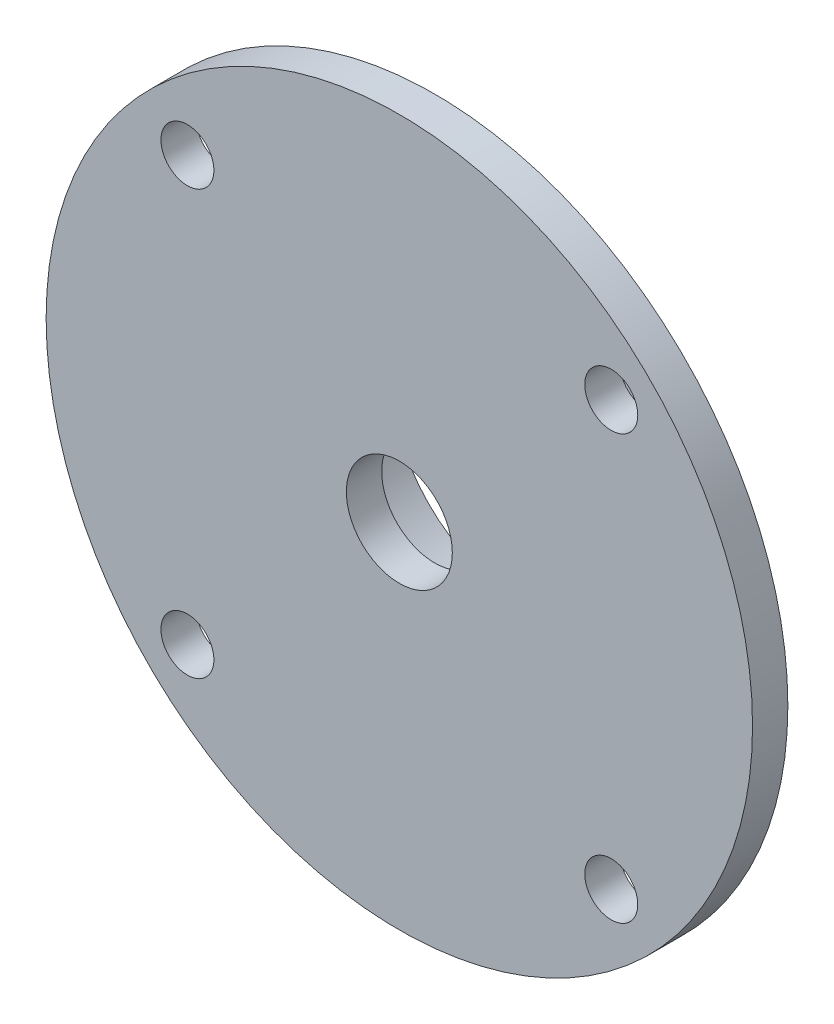
ISO-10303-21;
HEADER;
FILE_DESCRIPTION(('STEP AP214'),'2;1');
FILE_NAME('part.step','',(''),(''),'','','');
FILE_SCHEMA(('AUTOMOTIVE_DESIGN { 1 0 10303 214 1 1 1 1 }'));
ENDSEC;
DATA;
#1=APPLICATION_CONTEXT('core data for automotive mechanical design processes');
#2=APPLICATION_PROTOCOL_DEFINITION('international standard','automotive_design',2000,#1);
#3=PRODUCT_CONTEXT('',#1,'mechanical');
#4=PRODUCT('Part','Part','',(#3));
#5=PRODUCT_RELATED_PRODUCT_CATEGORY('part','',(#4));
#6=PRODUCT_DEFINITION_FORMATION('','',#4);
#7=PRODUCT_DEFINITION_CONTEXT('part definition',#1,'design');
#8=PRODUCT_DEFINITION('design','',#6,#7);
#9=PRODUCT_DEFINITION_SHAPE('','',#8);
#10=(LENGTH_UNIT() NAMED_UNIT(*) SI_UNIT(.MILLI.,.METRE.));
#11=(NAMED_UNIT(*) PLANE_ANGLE_UNIT() SI_UNIT($,.RADIAN.));
#12=(NAMED_UNIT(*) SI_UNIT($,.STERADIAN.) SOLID_ANGLE_UNIT());
#13=UNCERTAINTY_MEASURE_WITH_UNIT(LENGTH_MEASURE(1.E-05),#10,'distance_accuracy_value','');
#14=(GEOMETRIC_REPRESENTATION_CONTEXT(3) GLOBAL_UNCERTAINTY_ASSIGNED_CONTEXT((#13)) GLOBAL_UNIT_ASSIGNED_CONTEXT((#10,
#11,#12)) REPRESENTATION_CONTEXT('',''));
#15=CARTESIAN_POINT('',(0.,0.,0.));
#16=DIRECTION('',(0.,0.,1.));
#17=DIRECTION('',(1.,0.,0.));
#18=AXIS2_PLACEMENT_3D('',#15,#16,#17);
#19=CARTESIAN_POINT('',(0.,0.,0.));
#20=DIRECTION('',(0.,0.,1.));
#21=DIRECTION('',(1.,0.,0.));
#22=AXIS2_PLACEMENT_3D('',#19,#20,#21);
#23=PLANE('',#22);
#24=CARTESIAN_POINT('',(0.,0.,0.));
#25=DIRECTION('',(0.,0.,1.));
#26=DIRECTION('',(1.,0.,0.));
#27=AXIS2_PLACEMENT_3D('',#24,#25,#26);
#28=CIRCLE('',#27,3.);
#29=CARTESIAN_POINT('',(3.,0.,0.));
#30=VERTEX_POINT('',#29);
#31=EDGE_CURVE('E55',#30,#30,#28,.T.);
#32=ORIENTED_EDGE('',*,*,#31,.T.);
#33=EDGE_LOOP('',(#32));
#34=FACE_BOUND('',#33,.T.);
#35=CARTESIAN_POINT('',(0.,0.,0.));
#36=DIRECTION('',(0.,0.,-1.));
#37=DIRECTION('',(-1.,0.,0.));
#38=AXIS2_PLACEMENT_3D('',#35,#36,#37);
#39=CIRCLE('',#38,7.5);
#40=CARTESIAN_POINT('',(-7.5,0.,0.));
#41=VERTEX_POINT('',#40);
#42=EDGE_CURVE('E82',#41,#41,#39,.T.);
#43=ORIENTED_EDGE('',*,*,#42,.T.);
#44=EDGE_LOOP('',(#43));
#45=FACE_BOUND('',#44,.T.);
#46=ADVANCED_FACE('F31',(#34,#45),#23,.F.);
#47=CARTESIAN_POINT('',(0.,0.,2.));
#48=DIRECTION('',(0.,0.,1.));
#49=DIRECTION('',(1.,0.,0.));
#50=AXIS2_PLACEMENT_3D('',#47,#48,#49);
#51=PLANE('',#50);
#52=CARTESIAN_POINT('',(12.0000000000004,-11.9999999999996,2.));
#53=DIRECTION('',(0.,0.,1.));
#54=DIRECTION('',(1.,0.,0.));
#55=AXIS2_PLACEMENT_3D('',#52,#53,#54);
#56=CIRCLE('',#55,1.50000000000055);
#57=CARTESIAN_POINT('',(13.5000000000009,-11.9999999999996,2.));
#58=VERTEX_POINT('',#57);
#59=EDGE_CURVE('E64',#58,#58,#56,.T.);
#60=ORIENTED_EDGE('',*,*,#59,.F.);
#61=EDGE_LOOP('',(#60));
#62=FACE_BOUND('',#61,.T.);
#63=CARTESIAN_POINT('',(0.,0.,2.));
#64=DIRECTION('',(0.,0.,1.));
#65=DIRECTION('',(1.,0.,0.));
#66=AXIS2_PLACEMENT_3D('',#63,#64,#65);
#67=CIRCLE('',#66,3.);
#68=CARTESIAN_POINT('',(3.,0.,2.));
#69=VERTEX_POINT('',#68);
#70=EDGE_CURVE('E52',#69,#69,#67,.T.);
#71=ORIENTED_EDGE('',*,*,#70,.F.);
#72=EDGE_LOOP('',(#71));
#73=FACE_BOUND('',#72,.T.);
#74=CARTESIAN_POINT('',(0.,0.,2.));
#75=DIRECTION('',(0.,0.,1.));
#76=DIRECTION('',(1.,0.,0.));
#77=AXIS2_PLACEMENT_3D('',#74,#75,#76);
#78=CIRCLE('',#77,20.);
#79=CARTESIAN_POINT('',(20.,0.,2.));
#80=VERTEX_POINT('',#79);
#81=EDGE_CURVE('E38',#80,#80,#78,.T.);
#82=ORIENTED_EDGE('',*,*,#81,.T.);
#83=EDGE_LOOP('',(#82));
#84=FACE_BOUND('',#83,.T.);
#85=CARTESIAN_POINT('',(-12.,12.,2.));
#86=DIRECTION('',(0.,0.,1.));
#87=DIRECTION('',(1.,0.,0.));
#88=AXIS2_PLACEMENT_3D('',#85,#86,#87);
#89=CIRCLE('',#88,1.50000000000055);
#90=CARTESIAN_POINT('',(-10.4999999999995,12.,2.));
#91=VERTEX_POINT('',#90);
#92=EDGE_CURVE('E47',#91,#91,#89,.T.);
#93=ORIENTED_EDGE('',*,*,#92,.F.);
#94=EDGE_LOOP('',(#93));
#95=FACE_BOUND('',#94,.T.);
#96=CARTESIAN_POINT('',(12.,12.0000000000004,2.));
#97=DIRECTION('',(0.,0.,1.));
#98=DIRECTION('',(1.,0.,0.));
#99=AXIS2_PLACEMENT_3D('',#96,#97,#98);
#100=CIRCLE('',#99,1.50000000000055);
#101=CARTESIAN_POINT('',(13.5000000000005,12.0000000000004,2.));
#102=VERTEX_POINT('',#101);
#103=EDGE_CURVE('E58',#102,#102,#100,.T.);
#104=ORIENTED_EDGE('',*,*,#103,.F.);
#105=EDGE_LOOP('',(#104));
#106=FACE_BOUND('',#105,.T.);
#107=CARTESIAN_POINT('',(-11.9999999999996,-12.,2.));
#108=DIRECTION('',(0.,0.,1.));
#109=DIRECTION('',(1.,0.,0.));
#110=AXIS2_PLACEMENT_3D('',#107,#108,#109);
#111=CIRCLE('',#110,1.50000000000055);
#112=CARTESIAN_POINT('',(-10.4999999999991,-12.,2.));
#113=VERTEX_POINT('',#112);
#114=EDGE_CURVE('E70',#113,#113,#111,.T.);
#115=ORIENTED_EDGE('',*,*,#114,.F.);
#116=EDGE_LOOP('',(#115));
#117=FACE_BOUND('',#116,.T.);
#118=ADVANCED_FACE('F108',(#62,#73,#84,#95,#106,#117),#51,.T.);
#119=CARTESIAN_POINT('',(0.,0.,0.));
#120=DIRECTION('',(0.,0.,1.));
#121=DIRECTION('',(1.,0.,0.));
#122=AXIS2_PLACEMENT_3D('',#119,#120,#121);
#123=CIRCLE('',#122,11.);
#124=CARTESIAN_POINT('',(11.,0.,0.));
#125=VERTEX_POINT('',#124);
#126=EDGE_CURVE('E10',#125,#125,#123,.F.);
#127=ORIENTED_EDGE('',*,*,#126,.F.);
#128=EDGE_LOOP('',(#127));
#129=FACE_BOUND('',#128,.T.);
#130=CARTESIAN_POINT('',(0.,0.,0.));
#131=DIRECTION('',(0.,0.,1.));
#132=DIRECTION('',(1.,0.,0.));
#133=AXIS2_PLACEMENT_3D('',#130,#131,#132);
#134=CIRCLE('',#133,20.);
#135=CARTESIAN_POINT('',(20.,0.,0.));
#136=VERTEX_POINT('',#135);
#137=EDGE_CURVE('E42',#136,#136,#134,.T.);
#138=ORIENTED_EDGE('',*,*,#137,.F.);
#139=EDGE_LOOP('',(#138));
#140=FACE_BOUND('',#139,.T.);
#141=CARTESIAN_POINT('',(-12.,12.,0.));
#142=DIRECTION('',(0.,0.,1.));
#143=DIRECTION('',(1.,0.,0.));
#144=AXIS2_PLACEMENT_3D('',#141,#142,#143);
#145=CIRCLE('',#144,1.50000000000055);
#146=CARTESIAN_POINT('',(-10.4999999999995,12.,0.));
#147=VERTEX_POINT('',#146);
#148=EDGE_CURVE('E49',#147,#147,#145,.T.);
#149=ORIENTED_EDGE('',*,*,#148,.T.);
#150=EDGE_LOOP('',(#149));
#151=FACE_BOUND('',#150,.T.);
#152=CARTESIAN_POINT('',(12.,12.0000000000004,0.));
#153=DIRECTION('',(0.,0.,1.));
#154=DIRECTION('',(1.,0.,0.));
#155=AXIS2_PLACEMENT_3D('',#152,#153,#154);
#156=CIRCLE('',#155,1.50000000000055);
#157=CARTESIAN_POINT('',(13.5000000000005,12.0000000000004,0.));
#158=VERTEX_POINT('',#157);
#159=EDGE_CURVE('E61',#158,#158,#156,.T.);
#160=ORIENTED_EDGE('',*,*,#159,.T.);
#161=EDGE_LOOP('',(#160));
#162=FACE_BOUND('',#161,.T.);
#163=CARTESIAN_POINT('',(12.0000000000004,-11.9999999999996,0.));
#164=DIRECTION('',(0.,0.,1.));
#165=DIRECTION('',(1.,0.,0.));
#166=AXIS2_PLACEMENT_3D('',#163,#164,#165);
#167=CIRCLE('',#166,1.50000000000055);
#168=CARTESIAN_POINT('',(13.5000000000009,-11.9999999999996,0.));
#169=VERTEX_POINT('',#168);
#170=EDGE_CURVE('E67',#169,#169,#167,.T.);
#171=ORIENTED_EDGE('',*,*,#170,.T.);
#172=EDGE_LOOP('',(#171));
#173=FACE_BOUND('',#172,.T.);
#174=CARTESIAN_POINT('',(-11.9999999999996,-12.,0.));
#175=DIRECTION('',(0.,0.,1.));
#176=DIRECTION('',(1.,0.,0.));
#177=AXIS2_PLACEMENT_3D('',#174,#175,#176);
#178=CIRCLE('',#177,1.50000000000055);
#179=CARTESIAN_POINT('',(-10.4999999999991,-12.,0.));
#180=VERTEX_POINT('',#179);
#181=EDGE_CURVE('E73',#180,#180,#178,.T.);
#182=ORIENTED_EDGE('',*,*,#181,.T.);
#183=EDGE_LOOP('',(#182));
#184=FACE_BOUND('',#183,.T.);
#185=ADVANCED_FACE('F110',(#129,#140,#151,#162,#173,#184),#23,.F.);
#186=CARTESIAN_POINT('',(0.,0.,2.));
#187=DIRECTION('',(0.,0.,-1.));
#188=DIRECTION('',(-1.,0.,0.));
#189=AXIS2_PLACEMENT_3D('',#186,#187,#188);
#190=CYLINDRICAL_SURFACE('',#189,20.);
#191=ORIENTED_EDGE('',*,*,#81,.F.);
#192=EDGE_LOOP('',(#191));
#193=FACE_BOUND('',#192,.T.);
#194=ORIENTED_EDGE('',*,*,#137,.T.);
#195=EDGE_LOOP('',(#194));
#196=FACE_BOUND('',#195,.T.);
#197=ADVANCED_FACE('F33',(#193,#196),#190,.T.);
#198=CARTESIAN_POINT('',(-12.,12.,2.));
#199=DIRECTION('',(0.,0.,-1.));
#200=DIRECTION('',(-1.,0.,0.));
#201=AXIS2_PLACEMENT_3D('',#198,#199,#200);
#202=CYLINDRICAL_SURFACE('',#201,1.50000000000055);
#203=ORIENTED_EDGE('',*,*,#92,.T.);
#204=EDGE_LOOP('',(#203));
#205=FACE_BOUND('',#204,.T.);
#206=ORIENTED_EDGE('',*,*,#148,.F.);
#207=EDGE_LOOP('',(#206));
#208=FACE_BOUND('',#207,.T.);
#209=ADVANCED_FACE('F122',(#205,#208),#202,.F.);
#210=CARTESIAN_POINT('',(0.,0.,2.));
#211=DIRECTION('',(0.,0.,-1.));
#212=DIRECTION('',(-1.,0.,0.));
#213=AXIS2_PLACEMENT_3D('',#210,#211,#212);
#214=CYLINDRICAL_SURFACE('',#213,3.);
#215=ORIENTED_EDGE('',*,*,#70,.T.);
#216=EDGE_LOOP('',(#215));
#217=FACE_BOUND('',#216,.T.);
#218=ORIENTED_EDGE('',*,*,#31,.F.);
#219=EDGE_LOOP('',(#218));
#220=FACE_BOUND('',#219,.T.);
#221=ADVANCED_FACE('F143',(#217,#220),#214,.F.);
#222=CARTESIAN_POINT('',(12.,12.0000000000004,2.));
#223=DIRECTION('',(0.,0.,-1.));
#224=DIRECTION('',(-1.,0.,0.));
#225=AXIS2_PLACEMENT_3D('',#222,#223,#224);
#226=CYLINDRICAL_SURFACE('',#225,1.50000000000055);
#227=ORIENTED_EDGE('',*,*,#103,.T.);
#228=EDGE_LOOP('',(#227));
#229=FACE_BOUND('',#228,.T.);
#230=ORIENTED_EDGE('',*,*,#159,.F.);
#231=EDGE_LOOP('',(#230));
#232=FACE_BOUND('',#231,.T.);
#233=ADVANCED_FACE('F137',(#229,#232),#226,.F.);
#234=CARTESIAN_POINT('',(12.0000000000004,-11.9999999999996,2.));
#235=DIRECTION('',(0.,0.,-1.));
#236=DIRECTION('',(-1.,0.,0.));
#237=AXIS2_PLACEMENT_3D('',#234,#235,#236);
#238=CYLINDRICAL_SURFACE('',#237,1.50000000000055);
#239=ORIENTED_EDGE('',*,*,#59,.T.);
#240=EDGE_LOOP('',(#239));
#241=FACE_BOUND('',#240,.T.);
#242=ORIENTED_EDGE('',*,*,#170,.F.);
#243=EDGE_LOOP('',(#242));
#244=FACE_BOUND('',#243,.T.);
#245=ADVANCED_FACE('F103',(#241,#244),#238,.F.);
#246=CARTESIAN_POINT('',(-11.9999999999996,-12.,2.));
#247=DIRECTION('',(0.,0.,-1.));
#248=DIRECTION('',(-1.,0.,0.));
#249=AXIS2_PLACEMENT_3D('',#246,#247,#248);
#250=CYLINDRICAL_SURFACE('',#249,1.50000000000055);
#251=ORIENTED_EDGE('',*,*,#114,.T.);
#252=EDGE_LOOP('',(#251));
#253=FACE_BOUND('',#252,.T.);
#254=ORIENTED_EDGE('',*,*,#181,.F.);
#255=EDGE_LOOP('',(#254));
#256=FACE_BOUND('',#255,.T.);
#257=ADVANCED_FACE('F94',(#253,#256),#250,.F.);
#258=CARTESIAN_POINT('',(0.,0.,-5.));
#259=DIRECTION('',(0.,0.,-1.));
#260=DIRECTION('',(-1.,0.,0.));
#261=AXIS2_PLACEMENT_3D('',#258,#259,#260);
#262=PLANE('',#261);
#263=CARTESIAN_POINT('',(0.,0.,-5.));
#264=DIRECTION('',(0.,0.,-1.));
#265=DIRECTION('',(-1.,0.,0.));
#266=AXIS2_PLACEMENT_3D('',#263,#264,#265);
#267=CIRCLE('',#266,11.);
#268=CARTESIAN_POINT('',(-11.,0.,-5.));
#269=VERTEX_POINT('',#268);
#270=EDGE_CURVE('E76',#269,#269,#267,.T.);
#271=ORIENTED_EDGE('',*,*,#270,.T.);
#272=EDGE_LOOP('',(#271));
#273=FACE_BOUND('',#272,.T.);
#274=CARTESIAN_POINT('',(0.,0.,-5.));
#275=DIRECTION('',(0.,0.,-1.));
#276=DIRECTION('',(-1.,0.,0.));
#277=AXIS2_PLACEMENT_3D('',#274,#275,#276);
#278=CIRCLE('',#277,7.5);
#279=CARTESIAN_POINT('',(-7.5,0.,-5.));
#280=VERTEX_POINT('',#279);
#281=EDGE_CURVE('E81',#280,#280,#278,.T.);
#282=ORIENTED_EDGE('',*,*,#281,.F.);
#283=EDGE_LOOP('',(#282));
#284=FACE_BOUND('',#283,.T.);
#285=ADVANCED_FACE('F91',(#273,#284),#262,.T.);
#286=CARTESIAN_POINT('',(0.,0.,-5.));
#287=DIRECTION('',(0.,0.,1.));
#288=DIRECTION('',(1.,0.,0.));
#289=AXIS2_PLACEMENT_3D('',#286,#287,#288);
#290=CYLINDRICAL_SURFACE('',#289,11.);
#291=ORIENTED_EDGE('',*,*,#270,.F.);
#292=EDGE_LOOP('',(#291));
#293=FACE_BOUND('',#292,.T.);
#294=ORIENTED_EDGE('',*,*,#126,.T.);
#295=EDGE_LOOP('',(#294));
#296=FACE_BOUND('',#295,.T.);
#297=ADVANCED_FACE('F93',(#293,#296),#290,.T.);
#298=CARTESIAN_POINT('',(0.,0.,-5.));
#299=DIRECTION('',(0.,0.,1.));
#300=DIRECTION('',(1.,0.,0.));
#301=AXIS2_PLACEMENT_3D('',#298,#299,#300);
#302=CYLINDRICAL_SURFACE('',#301,7.5);
#303=ORIENTED_EDGE('',*,*,#281,.T.);
#304=EDGE_LOOP('',(#303));
#305=FACE_BOUND('',#304,.T.);
#306=ORIENTED_EDGE('',*,*,#42,.F.);
#307=EDGE_LOOP('',(#306));
#308=FACE_BOUND('',#307,.T.);
#309=ADVANCED_FACE('F88',(#305,#308),#302,.F.);
#310=CLOSED_SHELL('',(#46,#118,#185,#197,#209,#221,#233,#245,#257,#285,#297,#309));
#311=MANIFOLD_SOLID_BREP('B2',#310);
#312=ADVANCED_BREP_SHAPE_REPRESENTATION('',(#18,#311),#14);
#313=SHAPE_DEFINITION_REPRESENTATION(#9,#312);
ENDSEC;
END-ISO-10303-21;
